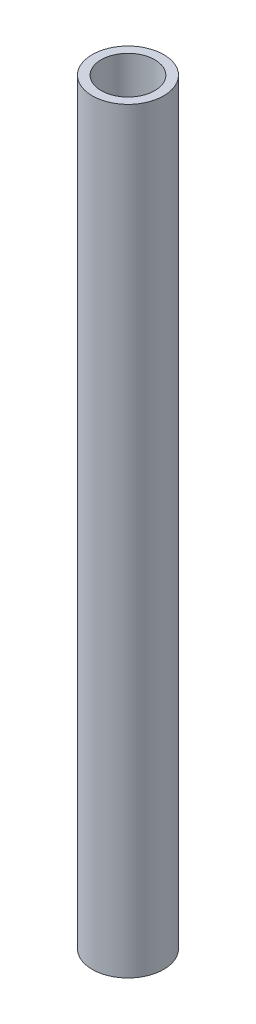
ISO-10303-21;
HEADER;
FILE_DESCRIPTION(('STEP AP214'),'2;1');
FILE_NAME('part.step','',(''),(''),'','','');
FILE_SCHEMA(('AUTOMOTIVE_DESIGN { 1 0 10303 214 1 1 1 1 }'));
ENDSEC;
DATA;
#1=APPLICATION_CONTEXT('core data for automotive mechanical design processes');
#2=APPLICATION_PROTOCOL_DEFINITION('international standard','automotive_design',2000,#1);
#3=PRODUCT_CONTEXT('',#1,'mechanical');
#4=PRODUCT('Part','Part','',(#3));
#5=PRODUCT_RELATED_PRODUCT_CATEGORY('part','',(#4));
#6=PRODUCT_DEFINITION_FORMATION('','',#4);
#7=PRODUCT_DEFINITION_CONTEXT('part definition',#1,'design');
#8=PRODUCT_DEFINITION('design','',#6,#7);
#9=PRODUCT_DEFINITION_SHAPE('','',#8);
#10=(LENGTH_UNIT() NAMED_UNIT(*) SI_UNIT(.MILLI.,.METRE.));
#11=(NAMED_UNIT(*) PLANE_ANGLE_UNIT() SI_UNIT($,.RADIAN.));
#12=(NAMED_UNIT(*) SI_UNIT($,.STERADIAN.) SOLID_ANGLE_UNIT());
#13=UNCERTAINTY_MEASURE_WITH_UNIT(LENGTH_MEASURE(1.E-05),#10,'distance_accuracy_value','');
#14=(GEOMETRIC_REPRESENTATION_CONTEXT(3) GLOBAL_UNCERTAINTY_ASSIGNED_CONTEXT((#13)) GLOBAL_UNIT_ASSIGNED_CONTEXT((#10,
#11,#12)) REPRESENTATION_CONTEXT('',''));
#15=CARTESIAN_POINT('',(0.,0.,0.));
#16=DIRECTION('',(0.,0.,1.));
#17=DIRECTION('',(1.,0.,0.));
#18=AXIS2_PLACEMENT_3D('',#15,#16,#17);
#19=CARTESIAN_POINT('',(0.,254.,0.));
#20=DIRECTION('',(0.,-1.,0.));
#21=DIRECTION('',(0.,0.,-1.));
#22=AXIS2_PLACEMENT_3D('',#19,#20,#21);
#23=CYLINDRICAL_SURFACE('',#22,12.);
#24=CARTESIAN_POINT('',(0.,254.,0.));
#25=DIRECTION('',(0.,1.,0.));
#26=DIRECTION('',(0.,0.,1.));
#27=AXIS2_PLACEMENT_3D('',#24,#25,#26);
#28=CIRCLE('',#27,12.);
#29=CARTESIAN_POINT('',(0.,254.,12.));
#30=VERTEX_POINT('',#29);
#31=EDGE_CURVE('E10',#30,#30,#28,.T.);
#32=ORIENTED_EDGE('',*,*,#31,.F.);
#33=EDGE_LOOP('',(#32));
#34=FACE_BOUND('',#33,.T.);
#35=CARTESIAN_POINT('',(0.,0.,0.));
#36=DIRECTION('',(0.,1.,0.));
#37=DIRECTION('',(0.,0.,1.));
#38=AXIS2_PLACEMENT_3D('',#35,#36,#37);
#39=CIRCLE('',#38,12.);
#40=CARTESIAN_POINT('',(0.,0.,12.));
#41=VERTEX_POINT('',#40);
#42=EDGE_CURVE('E46',#41,#41,#39,.T.);
#43=ORIENTED_EDGE('',*,*,#42,.T.);
#44=EDGE_LOOP('',(#43));
#45=FACE_BOUND('',#44,.T.);
#46=ADVANCED_FACE('F43',(#34,#45),#23,.T.);
#47=CARTESIAN_POINT('',(0.,254.,0.));
#48=DIRECTION('',(0.,1.,0.));
#49=DIRECTION('',(0.,0.,1.));
#50=AXIS2_PLACEMENT_3D('',#47,#48,#49);
#51=PLANE('',#50);
#52=CARTESIAN_POINT('',(0.,254.,0.));
#53=DIRECTION('',(0.,1.,0.));
#54=DIRECTION('',(0.,0.,1.));
#55=AXIS2_PLACEMENT_3D('',#52,#53,#54);
#56=CIRCLE('',#55,9.);
#57=CARTESIAN_POINT('',(0.,254.,9.));
#58=VERTEX_POINT('',#57);
#59=EDGE_CURVE('E57',#58,#58,#56,.T.);
#60=ORIENTED_EDGE('',*,*,#59,.F.);
#61=EDGE_LOOP('',(#60));
#62=FACE_BOUND('',#61,.T.);
#63=ORIENTED_EDGE('',*,*,#31,.T.);
#64=EDGE_LOOP('',(#63));
#65=FACE_BOUND('',#64,.T.);
#66=ADVANCED_FACE('F74',(#62,#65),#51,.T.);
#67=CARTESIAN_POINT('',(0.,0.,0.));
#68=DIRECTION('',(0.,1.,0.));
#69=DIRECTION('',(0.,0.,1.));
#70=AXIS2_PLACEMENT_3D('',#67,#68,#69);
#71=PLANE('',#70);
#72=CARTESIAN_POINT('',(0.,0.,0.));
#73=DIRECTION('',(0.,1.,0.));
#74=DIRECTION('',(0.,0.,1.));
#75=AXIS2_PLACEMENT_3D('',#72,#73,#74);
#76=CIRCLE('',#75,9.);
#77=CARTESIAN_POINT('',(0.,0.,9.));
#78=VERTEX_POINT('',#77);
#79=EDGE_CURVE('E55',#78,#78,#76,.T.);
#80=ORIENTED_EDGE('',*,*,#79,.T.);
#81=EDGE_LOOP('',(#80));
#82=FACE_BOUND('',#81,.T.);
#83=ORIENTED_EDGE('',*,*,#42,.F.);
#84=EDGE_LOOP('',(#83));
#85=FACE_BOUND('',#84,.T.);
#86=ADVANCED_FACE('F65',(#82,#85),#71,.F.);
#87=CARTESIAN_POINT('',(0.,0.,0.));
#88=DIRECTION('',(0.,1.,0.));
#89=DIRECTION('',(0.,0.,1.));
#90=AXIS2_PLACEMENT_3D('',#87,#88,#89);
#91=CYLINDRICAL_SURFACE('',#90,9.);
#92=ORIENTED_EDGE('',*,*,#79,.F.);
#93=EDGE_LOOP('',(#92));
#94=FACE_BOUND('',#93,.T.);
#95=ORIENTED_EDGE('',*,*,#59,.T.);
#96=EDGE_LOOP('',(#95));
#97=FACE_BOUND('',#96,.T.);
#98=ADVANCED_FACE('F68',(#94,#97),#91,.F.);
#99=CLOSED_SHELL('',(#46,#66,#86,#98));
#100=MANIFOLD_SOLID_BREP('B2',#99);
#101=ADVANCED_BREP_SHAPE_REPRESENTATION('',(#18,#100),#14);
#102=SHAPE_DEFINITION_REPRESENTATION(#9,#101);
ENDSEC;
END-ISO-10303-21;
